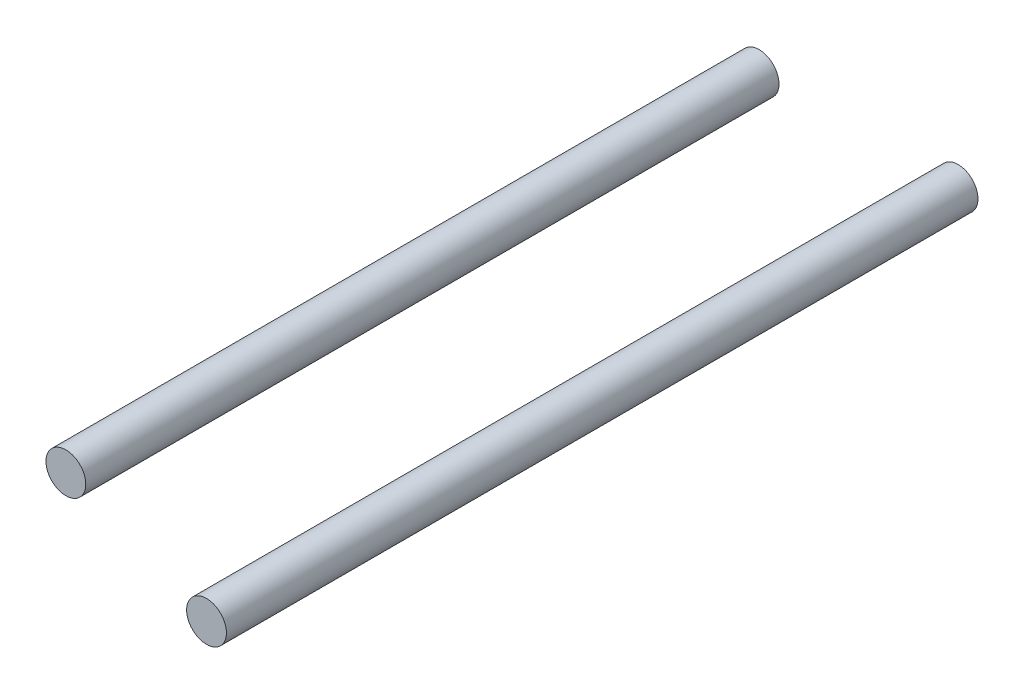
ISO-10303-21;
HEADER;
FILE_DESCRIPTION(('STEP AP214'),'2;1');
FILE_NAME('part.step','',(''),(''),'','','');
FILE_SCHEMA(('AUTOMOTIVE_DESIGN { 1 0 10303 214 1 1 1 1 }'));
ENDSEC;
DATA;
#1=APPLICATION_CONTEXT('core data for automotive mechanical design processes');
#2=APPLICATION_PROTOCOL_DEFINITION('international standard','automotive_design',2000,#1);
#3=PRODUCT_CONTEXT('',#1,'mechanical');
#4=PRODUCT('Part','Part','',(#3));
#5=PRODUCT_RELATED_PRODUCT_CATEGORY('part','',(#4));
#6=PRODUCT_DEFINITION_FORMATION('','',#4);
#7=PRODUCT_DEFINITION_CONTEXT('part definition',#1,'design');
#8=PRODUCT_DEFINITION('design','',#6,#7);
#9=PRODUCT_DEFINITION_SHAPE('','',#8);
#10=(LENGTH_UNIT() NAMED_UNIT(*) SI_UNIT(.MILLI.,.METRE.));
#11=(NAMED_UNIT(*) PLANE_ANGLE_UNIT() SI_UNIT($,.RADIAN.));
#12=(NAMED_UNIT(*) SI_UNIT($,.STERADIAN.) SOLID_ANGLE_UNIT());
#13=UNCERTAINTY_MEASURE_WITH_UNIT(LENGTH_MEASURE(1.E-05),#10,'distance_accuracy_value','');
#14=(GEOMETRIC_REPRESENTATION_CONTEXT(3) GLOBAL_UNCERTAINTY_ASSIGNED_CONTEXT((#13)) GLOBAL_UNIT_ASSIGNED_CONTEXT((#10,
#11,#12)) REPRESENTATION_CONTEXT('',''));
#15=CARTESIAN_POINT('',(0.,0.,0.));
#16=DIRECTION('',(0.,0.,1.));
#17=DIRECTION('',(1.,0.,0.));
#18=AXIS2_PLACEMENT_3D('',#15,#16,#17);
#19=CARTESIAN_POINT('',(15.,0.,104.5));
#20=DIRECTION('',(0.,0.,-1.));
#21=DIRECTION('',(-1.,0.,0.));
#22=AXIS2_PLACEMENT_3D('',#19,#20,#21);
#23=CYLINDRICAL_SURFACE('',#22,3.);
#24=CARTESIAN_POINT('',(15.,0.,0.));
#25=DIRECTION('',(0.,0.,1.));
#26=DIRECTION('',(1.,0.,0.));
#27=AXIS2_PLACEMENT_3D('',#24,#25,#26);
#28=CIRCLE('',#27,3.);
#29=CARTESIAN_POINT('',(18.,0.,0.));
#30=VERTEX_POINT('',#29);
#31=EDGE_CURVE('E11',#30,#30,#28,.T.);
#32=ORIENTED_EDGE('',*,*,#31,.T.);
#33=EDGE_LOOP('',(#32));
#34=FACE_BOUND('',#33,.T.);
#35=CARTESIAN_POINT('',(15.,0.,113.3));
#36=DIRECTION('',(0.,0.,1.));
#37=DIRECTION('',(1.,0.,0.));
#38=AXIS2_PLACEMENT_3D('',#35,#36,#37);
#39=CIRCLE('',#38,3.);
#40=CARTESIAN_POINT('',(18.,0.,113.3));
#41=VERTEX_POINT('',#40);
#42=EDGE_CURVE('E45',#41,#41,#39,.T.);
#43=ORIENTED_EDGE('',*,*,#42,.F.);
#44=EDGE_LOOP('',(#43));
#45=FACE_BOUND('',#44,.T.);
#46=ADVANCED_FACE('F39',(#34,#45),#23,.T.);
#47=CARTESIAN_POINT('',(15.,0.,0.));
#48=DIRECTION('',(0.,0.,1.));
#49=DIRECTION('',(1.,0.,0.));
#50=AXIS2_PLACEMENT_3D('',#47,#48,#49);
#51=PLANE('',#50);
#52=ORIENTED_EDGE('',*,*,#31,.F.);
#53=EDGE_LOOP('',(#52));
#54=FACE_BOUND('',#53,.T.);
#55=ADVANCED_FACE('F54',(#54),#51,.F.);
#56=CARTESIAN_POINT('',(15.,0.,113.3));
#57=DIRECTION('',(0.,0.,1.));
#58=DIRECTION('',(1.,0.,0.));
#59=AXIS2_PLACEMENT_3D('',#56,#57,#58);
#60=PLANE('',#59);
#61=ORIENTED_EDGE('',*,*,#42,.T.);
#62=EDGE_LOOP('',(#61));
#63=FACE_BOUND('',#62,.T.);
#64=ADVANCED_FACE('F51',(#63),#60,.T.);
#65=CLOSED_SHELL('',(#46,#55,#64));
#66=MANIFOLD_SOLID_BREP('B2',#65);
#67=CARTESIAN_POINT('',(-15.,0.,104.5));
#68=DIRECTION('',(0.,0.,-1.));
#69=DIRECTION('',(-1.,0.,0.));
#70=AXIS2_PLACEMENT_3D('',#67,#68,#69);
#71=CYLINDRICAL_SURFACE('',#70,3.);
#72=CARTESIAN_POINT('',(-15.,0.,104.5));
#73=DIRECTION('',(0.,0.,1.));
#74=DIRECTION('',(1.,0.,0.));
#75=AXIS2_PLACEMENT_3D('',#72,#73,#74);
#76=CIRCLE('',#75,3.);
#77=CARTESIAN_POINT('',(-12.,0.,104.5));
#78=VERTEX_POINT('',#77);
#79=EDGE_CURVE('E38',#78,#78,#76,.T.);
#80=ORIENTED_EDGE('',*,*,#79,.F.);
#81=EDGE_LOOP('',(#80));
#82=FACE_BOUND('',#81,.T.);
#83=CARTESIAN_POINT('',(-15.,0.,0.));
#84=DIRECTION('',(0.,0.,1.));
#85=DIRECTION('',(1.,0.,0.));
#86=AXIS2_PLACEMENT_3D('',#83,#84,#85);
#87=CIRCLE('',#86,3.);
#88=CARTESIAN_POINT('',(-12.,0.,0.));
#89=VERTEX_POINT('',#88);
#90=EDGE_CURVE('E86',#89,#89,#87,.T.);
#91=ORIENTED_EDGE('',*,*,#90,.T.);
#92=EDGE_LOOP('',(#91));
#93=FACE_BOUND('',#92,.T.);
#94=ADVANCED_FACE('F83',(#82,#93),#71,.T.);
#95=CARTESIAN_POINT('',(-15.,0.,104.5));
#96=DIRECTION('',(0.,0.,1.));
#97=DIRECTION('',(1.,0.,0.));
#98=AXIS2_PLACEMENT_3D('',#95,#96,#97);
#99=PLANE('',#98);
#100=ORIENTED_EDGE('',*,*,#79,.T.);
#101=EDGE_LOOP('',(#100));
#102=FACE_BOUND('',#101,.T.);
#103=ADVANCED_FACE('F98',(#102),#99,.T.);
#104=CARTESIAN_POINT('',(-15.,0.,0.));
#105=DIRECTION('',(0.,0.,1.));
#106=DIRECTION('',(1.,0.,0.));
#107=AXIS2_PLACEMENT_3D('',#104,#105,#106);
#108=PLANE('',#107);
#109=ORIENTED_EDGE('',*,*,#90,.F.);
#110=EDGE_LOOP('',(#109));
#111=FACE_BOUND('',#110,.T.);
#112=ADVANCED_FACE('F96',(#111),#108,.F.);
#113=CLOSED_SHELL('',(#94,#103,#112));
#114=MANIFOLD_SOLID_BREP('B6',#113);
#115=ADVANCED_BREP_SHAPE_REPRESENTATION('',(#18,#66,#114),#14);
#116=SHAPE_DEFINITION_REPRESENTATION(#9,#115);
ENDSEC;
END-ISO-10303-21;
